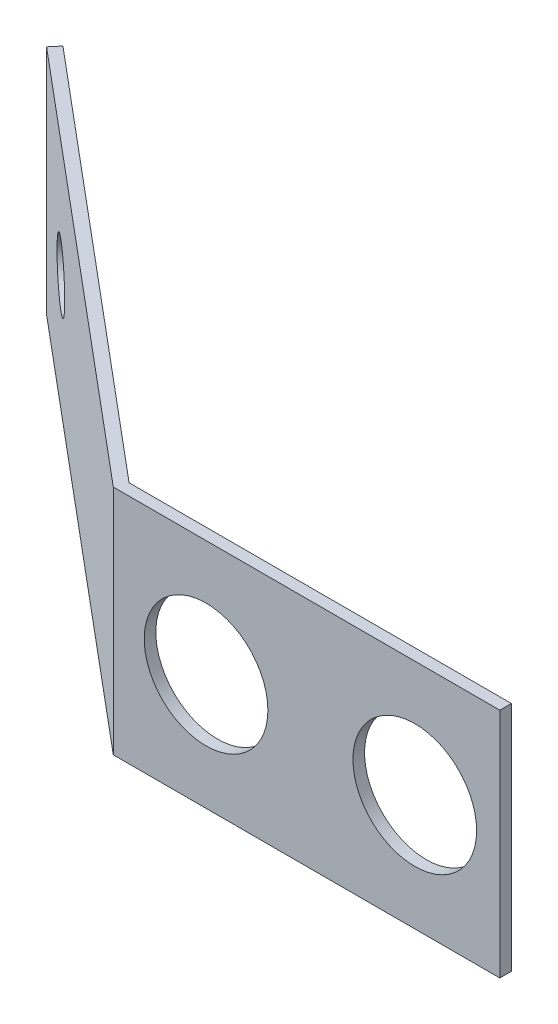
ISO-10303-21;
HEADER;
FILE_DESCRIPTION(('STEP AP214'),'2;1');
FILE_NAME('part.step','',(''),(''),'','','');
FILE_SCHEMA(('AUTOMOTIVE_DESIGN { 1 0 10303 214 1 1 1 1 }'));
ENDSEC;
DATA;
#1=APPLICATION_CONTEXT('core data for automotive mechanical design processes');
#2=APPLICATION_PROTOCOL_DEFINITION('international standard','automotive_design',2000,#1);
#3=PRODUCT_CONTEXT('',#1,'mechanical');
#4=PRODUCT('Part','Part','',(#3));
#5=PRODUCT_RELATED_PRODUCT_CATEGORY('part','',(#4));
#6=PRODUCT_DEFINITION_FORMATION('','',#4);
#7=PRODUCT_DEFINITION_CONTEXT('part definition',#1,'design');
#8=PRODUCT_DEFINITION('design','',#6,#7);
#9=PRODUCT_DEFINITION_SHAPE('','',#8);
#10=(LENGTH_UNIT() NAMED_UNIT(*) SI_UNIT(.MILLI.,.METRE.));
#11=(NAMED_UNIT(*) PLANE_ANGLE_UNIT() SI_UNIT($,.RADIAN.));
#12=(NAMED_UNIT(*) SI_UNIT($,.STERADIAN.) SOLID_ANGLE_UNIT());
#13=UNCERTAINTY_MEASURE_WITH_UNIT(LENGTH_MEASURE(1.E-05),#10,'distance_accuracy_value','');
#14=(GEOMETRIC_REPRESENTATION_CONTEXT(3) GLOBAL_UNCERTAINTY_ASSIGNED_CONTEXT((#13)) GLOBAL_UNIT_ASSIGNED_CONTEXT((#10,
#11,#12)) REPRESENTATION_CONTEXT('',''));
#15=CARTESIAN_POINT('',(0.,0.,0.));
#16=DIRECTION('',(0.,0.,1.));
#17=DIRECTION('',(1.,0.,0.));
#18=AXIS2_PLACEMENT_3D('',#15,#16,#17);
#19=CARTESIAN_POINT('',(0.964181414529808,30.,-1.14906666467843));
#20=DIRECTION('',(-0.642787609686535,0.,0.766044443118982));
#21=DIRECTION('',(0.766044443118982,0.,0.642787609686535));
#22=AXIS2_PLACEMENT_3D('',#19,#20,#21);
#23=PLANE('',#22);
#24=CARTESIAN_POINT('',(-41.1682629570141,15.,-36.5023851974379));
#25=DIRECTION('',(-0.642787609686535,0.,0.766044443118982));
#26=DIRECTION('',(0.766044443118982,0.,0.642787609686535));
#27=AXIS2_PLACEMENT_3D('',#24,#25,#26);
#28=CIRCLE('',#27,4.);
#29=CARTESIAN_POINT('',(-38.1040851845382,15.,-33.9312347586917));
#30=VERTEX_POINT('',#29);
#31=EDGE_CURVE('E122',#30,#30,#28,.T.);
#32=ORIENTED_EDGE('',*,*,#31,.T.);
#33=EDGE_LOOP('',(#32));
#34=FACE_BOUND('',#33,.T.);
#35=DIRECTION('',(-0.766044443118982,0.,-0.642787609686535));
#36=VECTOR('',#35,1.);
#37=CARTESIAN_POINT('',(0.96418141452978,0.,-1.14906666467848));
#38=LINE('',#37,#36);
#39=CARTESIAN_POINT('',(0.545955351399341,0.,-1.49999999999997));
#40=VERTEX_POINT('',#39);
#41=CARTESIAN_POINT('',(-52.6589296037989,0.,-46.1441993427359));
#42=VERTEX_POINT('',#41);
#43=EDGE_CURVE('E118',#40,#42,#38,.T.);
#44=ORIENTED_EDGE('',*,*,#43,.T.);
#45=DIRECTION('',(0.,-1.,0.));
#46=VECTOR('',#45,1.);
#47=CARTESIAN_POINT('',(-52.6589296037989,30.,-46.144199342736));
#48=LINE('',#47,#46);
#49=CARTESIAN_POINT('',(-52.6589296037989,30.,-46.144199342736));
#50=VERTEX_POINT('',#49);
#51=EDGE_CURVE('E11',#50,#42,#48,.T.);
#52=ORIENTED_EDGE('',*,*,#51,.F.);
#53=DIRECTION('',(-0.766044443118982,0.,-0.642787609686535));
#54=VECTOR('',#53,1.);
#55=CARTESIAN_POINT('',(0.964181414529808,30.,-1.14906666467843));
#56=LINE('',#55,#54);
#57=CARTESIAN_POINT('',(0.545955351399258,30.,-1.49999999999995));
#58=VERTEX_POINT('',#57);
#59=EDGE_CURVE('E83',#58,#50,#56,.T.);
#60=ORIENTED_EDGE('',*,*,#59,.F.);
#61=DIRECTION('',(0.,-1.,0.));
#62=VECTOR('',#61,1.);
#63=CARTESIAN_POINT('',(0.545955351399258,30.,-1.49999999999995));
#64=LINE('',#63,#62);
#65=EDGE_CURVE('E114',#58,#40,#64,.T.);
#66=ORIENTED_EDGE('',*,*,#65,.T.);
#67=EDGE_LOOP('',(#44,#52,#60,#66));
#68=FACE_BOUND('',#67,.T.);
#69=ADVANCED_FACE('F35',(#34,#68),#23,.F.);
#70=CARTESIAN_POINT('',(-53.6231110183288,30.,-44.9951326780575));
#71=DIRECTION('',(-0.766044443118979,0.,-0.642787609686538));
#72=DIRECTION('',(-0.642787609686538,0.,0.766044443118979));
#73=AXIS2_PLACEMENT_3D('',#70,#71,#72);
#74=PLANE('',#73);
#75=DIRECTION('',(0.642787609686538,0.,-0.766044443118979));
#76=VECTOR('',#75,1.);
#77=CARTESIAN_POINT('',(-53.6231110183287,0.,-44.9951326780574));
#78=LINE('',#77,#76);
#79=CARTESIAN_POINT('',(-53.6231110183287,0.,-44.9951326780574));
#80=VERTEX_POINT('',#79);
#81=EDGE_CURVE('E121',#80,#42,#78,.T.);
#82=ORIENTED_EDGE('',*,*,#81,.F.);
#83=DIRECTION('',(0.,-1.,0.));
#84=VECTOR('',#83,1.);
#85=CARTESIAN_POINT('',(-53.6231110183288,30.,-44.9951326780575));
#86=LINE('',#85,#84);
#87=CARTESIAN_POINT('',(-53.6231110183288,30.,-44.9951326780575));
#88=VERTEX_POINT('',#87);
#89=EDGE_CURVE('E44',#88,#80,#86,.T.);
#90=ORIENTED_EDGE('',*,*,#89,.F.);
#91=DIRECTION('',(0.642787609686538,0.,-0.766044443118979));
#92=VECTOR('',#91,1.);
#93=CARTESIAN_POINT('',(-53.6231110183288,30.,-44.9951326780575));
#94=LINE('',#93,#92);
#95=EDGE_CURVE('E154',#88,#50,#94,.T.);
#96=ORIENTED_EDGE('',*,*,#95,.T.);
#97=ORIENTED_EDGE('',*,*,#51,.T.);
#98=EDGE_LOOP('',(#82,#90,#96,#97));
#99=FACE_BOUND('',#98,.T.);
#100=ADVANCED_FACE('F176',(#99),#74,.T.);
#101=CARTESIAN_POINT('',(0.,30.,0.));
#102=DIRECTION('',(-0.642787609686535,0.,0.766044443118982));
#103=DIRECTION('',(0.766044443118982,0.,0.642787609686535));
#104=AXIS2_PLACEMENT_3D('',#101,#102,#103);
#105=PLANE('',#104);
#106=CARTESIAN_POINT('',(-42.132444371544,15.,-35.3533185327594));
#107=DIRECTION('',(-0.642787609686535,0.,0.766044443118982));
#108=DIRECTION('',(0.766044443118982,0.,0.642787609686535));
#109=AXIS2_PLACEMENT_3D('',#106,#107,#108);
#110=CIRCLE('',#109,4.);
#111=CARTESIAN_POINT('',(-39.068266599068,15.,-32.7821680940133));
#112=VERTEX_POINT('',#111);
#113=EDGE_CURVE('E137',#112,#112,#110,.T.);
#114=ORIENTED_EDGE('',*,*,#113,.F.);
#115=EDGE_LOOP('',(#114));
#116=FACE_BOUND('',#115,.T.);
#117=DIRECTION('',(-0.766044443118982,0.,-0.642787609686535));
#118=VECTOR('',#117,1.);
#119=CARTESIAN_POINT('',(0.,0.,0.));
#120=LINE('',#119,#118);
#121=CARTESIAN_POINT('',(0.,0.,0.));
#122=VERTEX_POINT('',#121);
#123=EDGE_CURVE('E125',#122,#80,#120,.T.);
#124=ORIENTED_EDGE('',*,*,#123,.F.);
#125=DIRECTION('',(0.,-1.,0.));
#126=VECTOR('',#125,1.);
#127=CARTESIAN_POINT('',(0.,30.,0.));
#128=LINE('',#127,#126);
#129=CARTESIAN_POINT('',(0.,30.,0.));
#130=VERTEX_POINT('',#129);
#131=EDGE_CURVE('E104',#130,#122,#128,.T.);
#132=ORIENTED_EDGE('',*,*,#131,.F.);
#133=DIRECTION('',(-0.766044443118982,0.,-0.642787609686535));
#134=VECTOR('',#133,1.);
#135=CARTESIAN_POINT('',(0.,30.,0.));
#136=LINE('',#135,#134);
#137=EDGE_CURVE('E110',#130,#88,#136,.T.);
#138=ORIENTED_EDGE('',*,*,#137,.T.);
#139=ORIENTED_EDGE('',*,*,#89,.T.);
#140=EDGE_LOOP('',(#124,#132,#138,#139));
#141=FACE_BOUND('',#140,.T.);
#142=ADVANCED_FACE('F158',(#116,#141),#105,.T.);
#143=CARTESIAN_POINT('',(0.,30.,0.));
#144=DIRECTION('',(0.,0.,1.));
#145=DIRECTION('',(1.,0.,0.));
#146=AXIS2_PLACEMENT_3D('',#143,#144,#145);
#147=PLANE('',#146);
#148=CARTESIAN_POINT('',(11.9999999999999,15.,0.));
#149=DIRECTION('',(0.,0.,1.));
#150=DIRECTION('',(1.,0.,0.));
#151=AXIS2_PLACEMENT_3D('',#148,#149,#150);
#152=CIRCLE('',#151,8.);
#153=CARTESIAN_POINT('',(19.9999999999999,15.,0.));
#154=VERTEX_POINT('',#153);
#155=EDGE_CURVE('E148',#154,#154,#152,.T.);
#156=ORIENTED_EDGE('',*,*,#155,.F.);
#157=EDGE_LOOP('',(#156));
#158=FACE_BOUND('',#157,.T.);
#159=CARTESIAN_POINT('',(39.,15.,0.));
#160=DIRECTION('',(0.,0.,1.));
#161=DIRECTION('',(1.,0.,0.));
#162=AXIS2_PLACEMENT_3D('',#159,#160,#161);
#163=CIRCLE('',#162,8.);
#164=CARTESIAN_POINT('',(47.,15.,0.));
#165=VERTEX_POINT('',#164);
#166=EDGE_CURVE('E138',#165,#165,#163,.T.);
#167=ORIENTED_EDGE('',*,*,#166,.F.);
#168=EDGE_LOOP('',(#167));
#169=FACE_BOUND('',#168,.T.);
#170=DIRECTION('',(-1.,0.,0.));
#171=VECTOR('',#170,1.);
#172=CARTESIAN_POINT('',(0.,0.,0.));
#173=LINE('',#172,#171);
#174=CARTESIAN_POINT('',(50.,0.,0.));
#175=VERTEX_POINT('',#174);
#176=EDGE_CURVE('E99',#175,#122,#173,.T.);
#177=ORIENTED_EDGE('',*,*,#176,.F.);
#178=DIRECTION('',(0.,-1.,0.));
#179=VECTOR('',#178,1.);
#180=CARTESIAN_POINT('',(50.,30.,0.));
#181=LINE('',#180,#179);
#182=CARTESIAN_POINT('',(50.,30.,0.));
#183=VERTEX_POINT('',#182);
#184=EDGE_CURVE('E94',#183,#175,#181,.T.);
#185=ORIENTED_EDGE('',*,*,#184,.F.);
#186=DIRECTION('',(-1.,0.,0.));
#187=VECTOR('',#186,1.);
#188=CARTESIAN_POINT('',(0.,30.,0.));
#189=LINE('',#188,#187);
#190=EDGE_CURVE('E97',#183,#130,#189,.T.);
#191=ORIENTED_EDGE('',*,*,#190,.T.);
#192=ORIENTED_EDGE('',*,*,#131,.T.);
#193=EDGE_LOOP('',(#177,#185,#191,#192));
#194=FACE_BOUND('',#193,.T.);
#195=ADVANCED_FACE('F96',(#158,#169,#194),#147,.T.);
#196=CARTESIAN_POINT('',(50.,30.,-1.49999999999995));
#197=DIRECTION('',(1.,0.,0.));
#198=DIRECTION('',(0.,0.,-1.));
#199=AXIS2_PLACEMENT_3D('',#196,#197,#198);
#200=PLANE('',#199);
#201=DIRECTION('',(0.,0.,1.));
#202=VECTOR('',#201,1.);
#203=CARTESIAN_POINT('',(49.9999999999999,0.,-1.49999999999997));
#204=LINE('',#203,#202);
#205=CARTESIAN_POINT('',(49.9999999999999,0.,-1.49999999999997));
#206=VERTEX_POINT('',#205);
#207=EDGE_CURVE('E129',#206,#175,#204,.T.);
#208=ORIENTED_EDGE('',*,*,#207,.F.);
#209=DIRECTION('',(0.,-1.,0.));
#210=VECTOR('',#209,1.);
#211=CARTESIAN_POINT('',(50.,30.,-1.49999999999995));
#212=LINE('',#211,#210);
#213=CARTESIAN_POINT('',(50.,30.,-1.49999999999995));
#214=VERTEX_POINT('',#213);
#215=EDGE_CURVE('E74',#214,#206,#212,.T.);
#216=ORIENTED_EDGE('',*,*,#215,.F.);
#217=DIRECTION('',(0.,0.,1.));
#218=VECTOR('',#217,1.);
#219=CARTESIAN_POINT('',(50.,30.,-1.49999999999995));
#220=LINE('',#219,#218);
#221=EDGE_CURVE('E108',#214,#183,#220,.T.);
#222=ORIENTED_EDGE('',*,*,#221,.T.);
#223=ORIENTED_EDGE('',*,*,#184,.T.);
#224=EDGE_LOOP('',(#208,#216,#222,#223));
#225=FACE_BOUND('',#224,.T.);
#226=ADVANCED_FACE('F112',(#225),#200,.T.);
#227=CARTESIAN_POINT('',(0.,30.,-1.49999999999995));
#228=DIRECTION('',(0.,0.,1.));
#229=DIRECTION('',(1.,0.,0.));
#230=AXIS2_PLACEMENT_3D('',#227,#228,#229);
#231=PLANE('',#230);
#232=CARTESIAN_POINT('',(12.0000000000001,15.,-1.5));
#233=DIRECTION('',(0.,0.,1.));
#234=DIRECTION('',(1.,0.,0.));
#235=AXIS2_PLACEMENT_3D('',#232,#233,#234);
#236=CIRCLE('',#235,8.);
#237=CARTESIAN_POINT('',(19.9999999999999,15.,-1.5));
#238=VERTEX_POINT('',#237);
#239=EDGE_CURVE('E38',#238,#238,#236,.T.);
#240=ORIENTED_EDGE('',*,*,#239,.T.);
#241=EDGE_LOOP('',(#240));
#242=FACE_BOUND('',#241,.T.);
#243=CARTESIAN_POINT('',(38.9999999999999,15.,-1.49999999999997));
#244=DIRECTION('',(0.,0.,1.));
#245=DIRECTION('',(1.,0.,0.));
#246=AXIS2_PLACEMENT_3D('',#243,#244,#245);
#247=CIRCLE('',#246,8.);
#248=CARTESIAN_POINT('',(47.,15.,-1.49999999999998));
#249=VERTEX_POINT('',#248);
#250=EDGE_CURVE('E135',#249,#249,#247,.T.);
#251=ORIENTED_EDGE('',*,*,#250,.T.);
#252=EDGE_LOOP('',(#251));
#253=FACE_BOUND('',#252,.T.);
#254=DIRECTION('',(1.,0.,0.));
#255=VECTOR('',#254,1.);
#256=CARTESIAN_POINT('',(0.,0.,-1.49999999999997));
#257=LINE('',#256,#255);
#258=EDGE_CURVE('E77',#206,#40,#257,.F.);
#259=ORIENTED_EDGE('',*,*,#258,.T.);
#260=ORIENTED_EDGE('',*,*,#65,.F.);
#261=DIRECTION('',(1.,0.,0.));
#262=VECTOR('',#261,1.);
#263=CARTESIAN_POINT('',(0.,30.,-1.49999999999995));
#264=LINE('',#263,#262);
#265=EDGE_CURVE('E53',#214,#58,#264,.F.);
#266=ORIENTED_EDGE('',*,*,#265,.F.);
#267=ORIENTED_EDGE('',*,*,#215,.T.);
#268=EDGE_LOOP('',(#259,#260,#266,#267));
#269=FACE_BOUND('',#268,.T.);
#270=ADVANCED_FACE('F164',(#242,#253,#269),#231,.F.);
#271=CARTESIAN_POINT('',(0.,30.,0.));
#272=DIRECTION('',(0.,-1.,0.));
#273=DIRECTION('',(-1.,0.,0.));
#274=AXIS2_PLACEMENT_3D('',#271,#272,#273);
#275=PLANE('',#274);
#276=ORIENTED_EDGE('',*,*,#59,.T.);
#277=ORIENTED_EDGE('',*,*,#95,.F.);
#278=ORIENTED_EDGE('',*,*,#137,.F.);
#279=ORIENTED_EDGE('',*,*,#190,.F.);
#280=ORIENTED_EDGE('',*,*,#221,.F.);
#281=ORIENTED_EDGE('',*,*,#265,.T.);
#282=EDGE_LOOP('',(#276,#277,#278,#279,#280,#281));
#283=FACE_BOUND('',#282,.T.);
#284=ADVANCED_FACE('F107',(#283),#275,.F.);
#285=CARTESIAN_POINT('',(0.,0.,0.));
#286=DIRECTION('',(0.,-1.,0.));
#287=DIRECTION('',(-1.,0.,0.));
#288=AXIS2_PLACEMENT_3D('',#285,#286,#287);
#289=PLANE('',#288);
#290=ORIENTED_EDGE('',*,*,#43,.F.);
#291=ORIENTED_EDGE('',*,*,#258,.F.);
#292=ORIENTED_EDGE('',*,*,#207,.T.);
#293=ORIENTED_EDGE('',*,*,#176,.T.);
#294=ORIENTED_EDGE('',*,*,#123,.T.);
#295=ORIENTED_EDGE('',*,*,#81,.T.);
#296=EDGE_LOOP('',(#290,#291,#292,#293,#294,#295));
#297=FACE_BOUND('',#296,.T.);
#298=ADVANCED_FACE('F162',(#297),#289,.T.);
#299=CARTESIAN_POINT('',(-35.7045682746786,15.,-43.0137629639492));
#300=DIRECTION('',(-0.642787609686535,0.,0.766044443118982));
#301=DIRECTION('',(0.766044443118982,0.,0.642787609686535));
#302=AXIS2_PLACEMENT_3D('',#299,#300,#301);
#303=CYLINDRICAL_SURFACE('',#302,4.);
#304=CARTESIAN_POINT('',(-39.068266599068,15.,-32.7821680940133));
#305=CARTESIAN_POINT('',(-39.0582230426667,15.,-32.794137538437));
#306=CARTESIAN_POINT('',(-39.0481794862653,15.,-32.8061069828607));
#307=CARTESIAN_POINT('',(-39.0280923734626,15.,-32.8300458717082));
#308=CARTESIAN_POINT('',(-39.0180488170613,15.,-32.8420153161319));
#309=CARTESIAN_POINT('',(-38.9979617042586,15.,-32.8659542049794));
#310=CARTESIAN_POINT('',(-38.9879181478572,15.,-32.8779236494031));
#311=CARTESIAN_POINT('',(-38.9678310350545,15.,-32.9018625382506));
#312=CARTESIAN_POINT('',(-38.9577874786532,15.,-32.9138319826743));
#313=CARTESIAN_POINT('',(-38.9377003658505,15.,-32.9377708715218));
#314=CARTESIAN_POINT('',(-38.9276568094491,15.,-32.9497403159455));
#315=CARTESIAN_POINT('',(-38.9075696966464,15.,-32.973679204793));
#316=CARTESIAN_POINT('',(-38.8975261402451,15.,-32.9856486492167));
#317=CARTESIAN_POINT('',(-38.8774390274424,15.,-33.0095875380642));
#318=CARTESIAN_POINT('',(-38.867395471041,15.,-33.0215569824879));
#319=CARTESIAN_POINT('',(-38.8473083582383,15.,-33.0454958713354));
#320=CARTESIAN_POINT('',(-38.8372648018369,15.,-33.0574653157591));
#321=CARTESIAN_POINT('',(-38.8171776890342,15.,-33.0814042046066));
#322=CARTESIAN_POINT('',(-38.8071341326329,15.,-33.0933736490304));
#323=CARTESIAN_POINT('',(-38.7870470198302,15.,-33.1173125378778));
#324=CARTESIAN_POINT('',(-38.7770034634288,15.,-33.1292819823015));
#325=CARTESIAN_POINT('',(-38.7569163506261,15.,-33.153220871149));
#326=CARTESIAN_POINT('',(-38.7468727942248,15.,-33.1651903155728));
#327=CARTESIAN_POINT('',(-38.7267856814221,15.,-33.1891292044202));
#328=CARTESIAN_POINT('',(-38.7167421250207,15.,-33.201098648844));
#329=CARTESIAN_POINT('',(-38.696655012218,15.,-33.2250375376914));
#330=CARTESIAN_POINT('',(-38.6866114558167,15.,-33.2370069821152));
#331=CARTESIAN_POINT('',(-38.666524343014,15.,-33.2609458709626));
#332=CARTESIAN_POINT('',(-38.6564807866126,15.,-33.2729153153864));
#333=CARTESIAN_POINT('',(-38.6363936738099,15.,-33.2968542042338));
#334=CARTESIAN_POINT('',(-38.6263501174085,15.,-33.3088236486576));
#335=CARTESIAN_POINT('',(-38.6062630046058,15.,-33.332762537505));
#336=CARTESIAN_POINT('',(-38.5962194482045,15.,-33.3447319819288));
#337=CARTESIAN_POINT('',(-38.5761323354018,15.,-33.3686708707762));
#338=CARTESIAN_POINT('',(-38.5660887790004,15.,-33.3806403152));
#339=CARTESIAN_POINT('',(-38.5460016661977,15.,-33.4045792040474));
#340=CARTESIAN_POINT('',(-38.5359581097964,15.,-33.4165486484712));
#341=CARTESIAN_POINT('',(-38.5158709969937,15.,-33.4404875373186));
#342=CARTESIAN_POINT('',(-38.5058274405923,15.,-33.4524569817424));
#343=CARTESIAN_POINT('',(-38.4857403277896,15.,-33.4763958705898));
#344=CARTESIAN_POINT('',(-38.4756967713883,15.,-33.4883653150136));
#345=CARTESIAN_POINT('',(-38.4556096585856,15.,-33.512304203861));
#346=CARTESIAN_POINT('',(-38.4455661021842,15.,-33.5242736482848));
#347=CARTESIAN_POINT('',(-38.4254789893815,15.,-33.5482125371323));
#348=CARTESIAN_POINT('',(-38.4154354329801,15.,-33.560181981556));
#349=CARTESIAN_POINT('',(-38.3953483201774,15.,-33.5841208704035));
#350=CARTESIAN_POINT('',(-38.3853047637761,15.,-33.5960903148272));
#351=CARTESIAN_POINT('',(-38.3652176509734,15.,-33.6200292036747));
#352=CARTESIAN_POINT('',(-38.355174094572,15.,-33.6319986480984));
#353=CARTESIAN_POINT('',(-38.3350869817693,15.,-33.6559375369458));
#354=CARTESIAN_POINT('',(-38.325043425368,15.,-33.6679069813696));
#355=CARTESIAN_POINT('',(-38.3049563125653,15.,-33.6918458702171));
#356=CARTESIAN_POINT('',(-38.2949127561639,15.,-33.7038153146408));
#357=CARTESIAN_POINT('',(-38.2748256433612,15.,-33.7277542034883));
#358=CARTESIAN_POINT('',(-38.2647820869599,15.,-33.739723647912));
#359=CARTESIAN_POINT('',(-38.2446949741572,15.,-33.7636625367595));
#360=CARTESIAN_POINT('',(-38.2346514177558,15.,-33.7756319811832));
#361=CARTESIAN_POINT('',(-38.2145643049531,15.,-33.7995708700307));
#362=CARTESIAN_POINT('',(-38.2045207485518,15.,-33.8115403144544));
#363=CARTESIAN_POINT('',(-38.1844336357491,15.,-33.8354792033019));
#364=CARTESIAN_POINT('',(-38.1743900793477,15.,-33.8474486477256));
#365=CARTESIAN_POINT('',(-38.154302966545,15.,-33.8713875365731));
#366=CARTESIAN_POINT('',(-38.1442594101436,15.,-33.8833569809968));
#367=CARTESIAN_POINT('',(-38.1241722973409,15.,-33.9072958698443));
#368=CARTESIAN_POINT('',(-38.1141287409396,15.,-33.919265314268));
#369=CARTESIAN_POINT('',(-38.1040851845382,15.,-33.9312347586917));
#370=B_SPLINE_CURVE_WITH_KNOTS('',3,(#304,#305,#306,#307,#308,#309,#310,#311,#312,#313,#314,
#315,#316,#317,#318,#319,#320,#321,#322,#323,#324,#325,#326,#327,#328,#329,#330,#331,#332,#333,
#334,#335,#336,#337,#338,#339,#340,#341,#342,#343,#344,#345,#346,#347,#348,#349,#350,#351,#352,
#353,#354,#355,#356,#357,#358,#359,#360,#361,#362,#363,#364,#365,#366,#367,#368,#369),
.UNSPECIFIED.,.F.,.F.,(4,2,2,2,2,2,2,2,2,2,2,2,2,2,2,2,2,2,2,2,2,2,2,2,2,2,2,2,2,2,2,2,4),(0.,
0.0468749999999912,0.0937499999999923,0.140624999999998,0.187499999999999,0.234375,
0.281250000000001,0.328125000000002,0.375000000000003,0.421875000000004,0.46875,
0.515625000000001,0.562500000000002,0.609375000000003,0.656250000000004,0.703125000000005,0.75,
0.796875000000001,0.843750000000002,0.890625000000004,0.937500000000005,0.984375000000006,
1.03125000000001,1.07812500000001,1.125,1.171875,1.21875000000001,1.26562500000001,
1.31250000000001,1.35937500000001,1.40625000000001,1.45312500000001,1.50000000000001),.UNSPECIFIED.);
#371=EDGE_CURVE('BSEAM184',#112,#30,#370,.T.);
#372=ORIENTED_EDGE('',*,*,#113,.T.);
#373=ORIENTED_EDGE('',*,*,#31,.F.);
#374=ORIENTED_EDGE('',*,*,#371,.T.);
#375=ORIENTED_EDGE('',*,*,#371,.F.);
#376=EDGE_LOOP('',(#372,#374,#373,#375));
#377=FACE_BOUND('',#376,.T.);
#378=ADVANCED_FACE('F184',(#377),#303,.F.);
#379=CARTESIAN_POINT('',(39.,15.,-9.99999999999995));
#380=DIRECTION('',(0.,0.,1.));
#381=DIRECTION('',(1.,0.,0.));
#382=AXIS2_PLACEMENT_3D('',#379,#380,#381);
#383=CYLINDRICAL_SURFACE('',#382,8.);
#384=CARTESIAN_POINT('',(47.,15.,0.));
#385=CARTESIAN_POINT('',(47.,15.,-0.0156249999999486));
#386=CARTESIAN_POINT('',(47.,15.,-0.0312499999999491));
#387=CARTESIAN_POINT('',(47.,15.,-0.0624999999999497));
#388=CARTESIAN_POINT('',(47.,15.,-0.0781249999999498));
#389=CARTESIAN_POINT('',(47.,15.,-0.10937499999995));
#390=CARTESIAN_POINT('',(47.,15.,-0.12499999999995));
#391=CARTESIAN_POINT('',(47.,15.,-0.15624999999995));
#392=CARTESIAN_POINT('',(47.,15.,-0.171874999999951));
#393=CARTESIAN_POINT('',(47.,15.,-0.203124999999952));
#394=CARTESIAN_POINT('',(47.,15.,-0.218749999999953));
#395=CARTESIAN_POINT('',(47.,15.,-0.249999999999953));
#396=CARTESIAN_POINT('',(47.,15.,-0.265624999999953));
#397=CARTESIAN_POINT('',(47.,15.,-0.296874999999953));
#398=CARTESIAN_POINT('',(47.,15.,-0.312499999999953));
#399=CARTESIAN_POINT('',(47.,15.,-0.343749999999954));
#400=CARTESIAN_POINT('',(47.,15.,-0.359374999999955));
#401=CARTESIAN_POINT('',(47.,15.,-0.390624999999956));
#402=CARTESIAN_POINT('',(47.,15.,-0.406249999999956));
#403=CARTESIAN_POINT('',(47.,15.,-0.437499999999957));
#404=CARTESIAN_POINT('',(47.,15.,-0.453124999999957));
#405=CARTESIAN_POINT('',(47.,15.,-0.484374999999957));
#406=CARTESIAN_POINT('',(47.,15.,-0.499999999999957));
#407=CARTESIAN_POINT('',(47.,15.,-0.531249999999958));
#408=CARTESIAN_POINT('',(47.,15.,-0.546874999999958));
#409=CARTESIAN_POINT('',(47.,15.,-0.578124999999959));
#410=CARTESIAN_POINT('',(47.,15.,-0.59374999999996));
#411=CARTESIAN_POINT('',(47.,15.,-0.624999999999961));
#412=CARTESIAN_POINT('',(47.,15.,-0.640624999999961));
#413=CARTESIAN_POINT('',(47.,15.,-0.671874999999961));
#414=CARTESIAN_POINT('',(47.,15.,-0.687499999999961));
#415=CARTESIAN_POINT('',(47.,15.,-0.718749999999961));
#416=CARTESIAN_POINT('',(47.,15.,-0.734374999999962));
#417=CARTESIAN_POINT('',(47.,15.,-0.765624999999963));
#418=CARTESIAN_POINT('',(47.,15.,-0.781249999999964));
#419=CARTESIAN_POINT('',(47.,15.,-0.812499999999964));
#420=CARTESIAN_POINT('',(47.,15.,-0.828124999999964));
#421=CARTESIAN_POINT('',(47.,15.,-0.859374999999964));
#422=CARTESIAN_POINT('',(47.,15.,-0.874999999999964));
#423=CARTESIAN_POINT('',(47.,15.,-0.906249999999965));
#424=CARTESIAN_POINT('',(47.,15.,-0.921874999999966));
#425=CARTESIAN_POINT('',(47.,15.,-0.953124999999967));
#426=CARTESIAN_POINT('',(47.,15.,-0.968749999999967));
#427=CARTESIAN_POINT('',(47.,15.,-0.999999999999968));
#428=CARTESIAN_POINT('',(47.,15.,-1.01562499999997));
#429=CARTESIAN_POINT('',(47.,15.,-1.04687499999997));
#430=CARTESIAN_POINT('',(47.,15.,-1.06249999999997));
#431=CARTESIAN_POINT('',(47.,15.,-1.09374999999997));
#432=CARTESIAN_POINT('',(47.,15.,-1.10937499999997));
#433=CARTESIAN_POINT('',(47.,15.,-1.14062499999997));
#434=CARTESIAN_POINT('',(47.,15.,-1.15624999999997));
#435=CARTESIAN_POINT('',(47.,15.,-1.18749999999997));
#436=CARTESIAN_POINT('',(47.,15.,-1.20312499999997));
#437=CARTESIAN_POINT('',(47.,15.,-1.23437499999997));
#438=CARTESIAN_POINT('',(47.,15.,-1.24999999999997));
#439=CARTESIAN_POINT('',(47.,15.,-1.28124999999997));
#440=CARTESIAN_POINT('',(47.,15.,-1.29687499999997));
#441=CARTESIAN_POINT('',(47.,15.,-1.32812499999997));
#442=CARTESIAN_POINT('',(47.,15.,-1.34374999999997));
#443=CARTESIAN_POINT('',(47.,15.,-1.37499999999998));
#444=CARTESIAN_POINT('',(47.,15.,-1.39062499999998));
#445=CARTESIAN_POINT('',(47.,15.,-1.42187499999998));
#446=CARTESIAN_POINT('',(47.,15.,-1.43749999999998));
#447=CARTESIAN_POINT('',(47.,15.,-1.46874999999998));
#448=CARTESIAN_POINT('',(47.,15.,-1.48437499999998));
#449=CARTESIAN_POINT('',(47.,15.,-1.49999999999998));
#450=B_SPLINE_CURVE_WITH_KNOTS('',3,(#384,#385,#386,#387,#388,#389,#390,#391,#392,#393,#394,
#395,#396,#397,#398,#399,#400,#401,#402,#403,#404,#405,#406,#407,#408,#409,#410,#411,#412,#413,
#414,#415,#416,#417,#418,#419,#420,#421,#422,#423,#424,#425,#426,#427,#428,#429,#430,#431,#432,
#433,#434,#435,#436,#437,#438,#439,#440,#441,#442,#443,#444,#445,#446,#447,#448,#449),
.UNSPECIFIED.,.F.,.F.,(4,2,2,2,2,2,2,2,2,2,2,2,2,2,2,2,2,2,2,2,2,2,2,2,2,2,2,2,2,2,2,2,4),(0.,
0.0468750000000018,0.0937500000000018,0.140625000000002,0.187500000000004,0.234375000000005,
0.281250000000005,0.328125000000005,0.375000000000007,0.421875000000009,0.468750000000009,
0.515625000000009,0.562500000000011,0.609375000000013,0.656250000000013,0.703125000000013,
0.750000000000015,0.796875000000016,0.843750000000016,0.890625000000016,0.937500000000018,
0.98437500000002,1.03125000000002,1.07812500000002,1.12500000000002,1.17187500000002,
1.21875000000002,1.26562500000002,1.31250000000003,1.35937500000003,1.40625000000003,
1.45312500000003,1.50000000000003),.UNSPECIFIED.);
#451=EDGE_CURVE('BSEAM186',#165,#249,#450,.T.);
#452=ORIENTED_EDGE('',*,*,#166,.T.);
#453=ORIENTED_EDGE('',*,*,#250,.F.);
#454=ORIENTED_EDGE('',*,*,#451,.T.);
#455=ORIENTED_EDGE('',*,*,#451,.F.);
#456=EDGE_LOOP('',(#452,#454,#453,#455));
#457=FACE_BOUND('',#456,.T.);
#458=ADVANCED_FACE('F186',(#457),#383,.F.);
#459=CARTESIAN_POINT('',(11.9999999999999,15.,-9.99999999999995));
#460=DIRECTION('',(0.,0.,1.));
#461=DIRECTION('',(1.,0.,0.));
#462=AXIS2_PLACEMENT_3D('',#459,#460,#461);
#463=CYLINDRICAL_SURFACE('',#462,8.);
#464=CARTESIAN_POINT('',(19.9999999999999,15.,0.));
#465=CARTESIAN_POINT('',(19.9999999999999,15.,-0.0156250000000035));
#466=CARTESIAN_POINT('',(19.9999999999999,15.,-0.0312500000000035));
#467=CARTESIAN_POINT('',(19.9999999999999,15.,-0.0625000000000035));
#468=CARTESIAN_POINT('',(19.9999999999999,15.,-0.0781250000000035));
#469=CARTESIAN_POINT('',(19.9999999999999,15.,-0.109375000000004));
#470=CARTESIAN_POINT('',(19.9999999999999,15.,-0.125000000000004));
#471=CARTESIAN_POINT('',(19.9999999999999,15.,-0.156250000000004));
#472=CARTESIAN_POINT('',(19.9999999999999,15.,-0.171875000000004));
#473=CARTESIAN_POINT('',(19.9999999999999,15.,-0.203125000000004));
#474=CARTESIAN_POINT('',(19.9999999999999,15.,-0.218750000000004));
#475=CARTESIAN_POINT('',(19.9999999999999,15.,-0.250000000000004));
#476=CARTESIAN_POINT('',(19.9999999999999,15.,-0.265625000000004));
#477=CARTESIAN_POINT('',(19.9999999999999,15.,-0.296875000000004));
#478=CARTESIAN_POINT('',(19.9999999999999,15.,-0.312500000000004));
#479=CARTESIAN_POINT('',(19.9999999999999,15.,-0.343750000000004));
#480=CARTESIAN_POINT('',(19.9999999999999,15.,-0.359375000000004));
#481=CARTESIAN_POINT('',(19.9999999999999,15.,-0.390625000000004));
#482=CARTESIAN_POINT('',(19.9999999999999,15.,-0.406250000000004));
#483=CARTESIAN_POINT('',(19.9999999999999,15.,-0.437500000000004));
#484=CARTESIAN_POINT('',(19.9999999999999,15.,-0.453125000000004));
#485=CARTESIAN_POINT('',(19.9999999999999,15.,-0.484375000000004));
#486=CARTESIAN_POINT('',(19.9999999999999,15.,-0.500000000000004));
#487=CARTESIAN_POINT('',(19.9999999999999,15.,-0.531250000000004));
#488=CARTESIAN_POINT('',(19.9999999999999,15.,-0.546875000000004));
#489=CARTESIAN_POINT('',(19.9999999999999,15.,-0.578125000000004));
#490=CARTESIAN_POINT('',(19.9999999999999,15.,-0.593750000000004));
#491=CARTESIAN_POINT('',(19.9999999999999,15.,-0.625000000000004));
#492=CARTESIAN_POINT('',(19.9999999999999,15.,-0.640625000000004));
#493=CARTESIAN_POINT('',(19.9999999999999,15.,-0.671875000000004));
#494=CARTESIAN_POINT('',(19.9999999999999,15.,-0.687500000000004));
#495=CARTESIAN_POINT('',(19.9999999999999,15.,-0.718750000000004));
#496=CARTESIAN_POINT('',(19.9999999999999,15.,-0.734375000000004));
#497=CARTESIAN_POINT('',(19.9999999999999,15.,-0.765625000000004));
#498=CARTESIAN_POINT('',(19.9999999999999,15.,-0.781250000000004));
#499=CARTESIAN_POINT('',(19.9999999999999,15.,-0.812500000000004));
#500=CARTESIAN_POINT('',(19.9999999999999,15.,-0.828125000000004));
#501=CARTESIAN_POINT('',(19.9999999999999,15.,-0.859375000000004));
#502=CARTESIAN_POINT('',(19.9999999999999,15.,-0.875000000000004));
#503=CARTESIAN_POINT('',(19.9999999999999,15.,-0.906250000000004));
#504=CARTESIAN_POINT('',(19.9999999999999,15.,-0.921875000000004));
#505=CARTESIAN_POINT('',(19.9999999999999,15.,-0.953125000000004));
#506=CARTESIAN_POINT('',(19.9999999999999,15.,-0.968750000000004));
#507=CARTESIAN_POINT('',(19.9999999999999,15.,-1.));
#508=CARTESIAN_POINT('',(19.9999999999999,15.,-1.015625));
#509=CARTESIAN_POINT('',(19.9999999999999,15.,-1.046875));
#510=CARTESIAN_POINT('',(19.9999999999999,15.,-1.0625));
#511=CARTESIAN_POINT('',(19.9999999999999,15.,-1.09375));
#512=CARTESIAN_POINT('',(19.9999999999999,15.,-1.109375));
#513=CARTESIAN_POINT('',(19.9999999999999,15.,-1.140625));
#514=CARTESIAN_POINT('',(19.9999999999999,15.,-1.15625));
#515=CARTESIAN_POINT('',(19.9999999999999,15.,-1.1875));
#516=CARTESIAN_POINT('',(19.9999999999999,15.,-1.203125));
#517=CARTESIAN_POINT('',(19.9999999999999,15.,-1.234375));
#518=CARTESIAN_POINT('',(19.9999999999999,15.,-1.25));
#519=CARTESIAN_POINT('',(19.9999999999999,15.,-1.28125));
#520=CARTESIAN_POINT('',(19.9999999999999,15.,-1.296875));
#521=CARTESIAN_POINT('',(19.9999999999999,15.,-1.328125));
#522=CARTESIAN_POINT('',(19.9999999999999,15.,-1.34375));
#523=CARTESIAN_POINT('',(19.9999999999999,15.,-1.375));
#524=CARTESIAN_POINT('',(19.9999999999999,15.,-1.390625));
#525=CARTESIAN_POINT('',(19.9999999999999,15.,-1.421875));
#526=CARTESIAN_POINT('',(19.9999999999999,15.,-1.4375));
#527=CARTESIAN_POINT('',(19.9999999999999,15.,-1.46875));
#528=CARTESIAN_POINT('',(19.9999999999999,15.,-1.484375));
#529=CARTESIAN_POINT('',(19.9999999999999,15.,-1.5));
#530=B_SPLINE_CURVE_WITH_KNOTS('',3,(#464,#465,#466,#467,#468,#469,#470,#471,#472,#473,#474,
#475,#476,#477,#478,#479,#480,#481,#482,#483,#484,#485,#486,#487,#488,#489,#490,#491,#492,#493,
#494,#495,#496,#497,#498,#499,#500,#501,#502,#503,#504,#505,#506,#507,#508,#509,#510,#511,#512,
#513,#514,#515,#516,#517,#518,#519,#520,#521,#522,#523,#524,#525,#526,#527,#528,#529),
.UNSPECIFIED.,.F.,.F.,(4,2,2,2,2,2,2,2,2,2,2,2,2,2,2,2,2,2,2,2,2,2,2,2,2,2,2,2,2,2,2,2,4),(0.,
0.046875,0.0937500000000001,0.140625,0.1875,0.234375,0.28125,0.328125,0.375,0.421875,0.46875,
0.515625,0.5625,0.609375000000001,0.656250000000001,0.703125000000001,0.750000000000001,
0.796875000000001,0.843750000000001,0.890625000000001,0.937500000000001,0.984375000000001,
1.03125,1.078125,1.125,1.171875,1.21875,1.265625,1.3125,1.359375,1.40625,1.453125,1.5),.UNSPECIFIED.);
#531=EDGE_CURVE('BSEAM193',#154,#238,#530,.T.);
#532=ORIENTED_EDGE('',*,*,#155,.T.);
#533=ORIENTED_EDGE('',*,*,#239,.F.);
#534=ORIENTED_EDGE('',*,*,#531,.T.);
#535=ORIENTED_EDGE('',*,*,#531,.F.);
#536=EDGE_LOOP('',(#532,#534,#533,#535));
#537=FACE_BOUND('',#536,.T.);
#538=ADVANCED_FACE('F193',(#537),#463,.F.);
#539=CLOSED_SHELL('',(#69,#100,#142,#195,#226,#270,#284,#298,#378,#458,#538));
#540=MANIFOLD_SOLID_BREP('B2',#539);
#541=ADVANCED_BREP_SHAPE_REPRESENTATION('',(#18,#540),#14);
#542=SHAPE_DEFINITION_REPRESENTATION(#9,#541);
ENDSEC;
END-ISO-10303-21;
